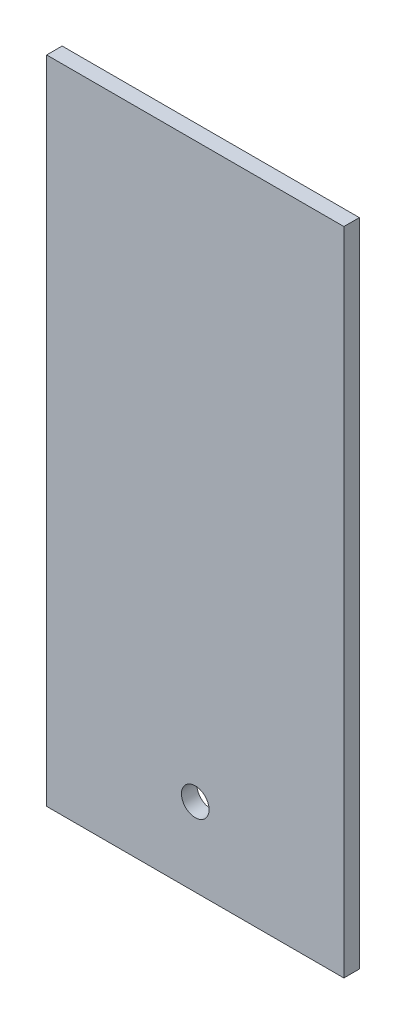
ISO-10303-21;
HEADER;
FILE_DESCRIPTION(('STEP AP214'),'2;1');
FILE_NAME('part.step','',(''),(''),'','','');
FILE_SCHEMA(('AUTOMOTIVE_DESIGN { 1 0 10303 214 1 1 1 1 }'));
ENDSEC;
DATA;
#1=APPLICATION_CONTEXT('core data for automotive mechanical design processes');
#2=APPLICATION_PROTOCOL_DEFINITION('international standard','automotive_design',2000,#1);
#3=PRODUCT_CONTEXT('',#1,'mechanical');
#4=PRODUCT('Part','Part','',(#3));
#5=PRODUCT_RELATED_PRODUCT_CATEGORY('part','',(#4));
#6=PRODUCT_DEFINITION_FORMATION('','',#4);
#7=PRODUCT_DEFINITION_CONTEXT('part definition',#1,'design');
#8=PRODUCT_DEFINITION('design','',#6,#7);
#9=PRODUCT_DEFINITION_SHAPE('','',#8);
#10=(LENGTH_UNIT() NAMED_UNIT(*) SI_UNIT(.MILLI.,.METRE.));
#11=(NAMED_UNIT(*) PLANE_ANGLE_UNIT() SI_UNIT($,.RADIAN.));
#12=(NAMED_UNIT(*) SI_UNIT($,.STERADIAN.) SOLID_ANGLE_UNIT());
#13=UNCERTAINTY_MEASURE_WITH_UNIT(LENGTH_MEASURE(1.E-05),#10,'distance_accuracy_value','');
#14=(GEOMETRIC_REPRESENTATION_CONTEXT(3) GLOBAL_UNCERTAINTY_ASSIGNED_CONTEXT((#13)) GLOBAL_UNIT_ASSIGNED_CONTEXT((#10,
#11,#12)) REPRESENTATION_CONTEXT('',''));
#15=CARTESIAN_POINT('',(0.,0.,0.));
#16=DIRECTION('',(0.,0.,1.));
#17=DIRECTION('',(1.,0.,0.));
#18=AXIS2_PLACEMENT_3D('',#15,#16,#17);
#19=CARTESIAN_POINT('',(26.9,-58.9,1.4));
#20=DIRECTION('',(0.,1.,0.));
#21=DIRECTION('',(0.,0.,1.));
#22=AXIS2_PLACEMENT_3D('',#19,#20,#21);
#23=PLANE('',#22);
#24=DIRECTION('',(1.,0.,0.));
#25=VECTOR('',#24,1.);
#26=CARTESIAN_POINT('',(26.9,-58.9,-1.4));
#27=LINE('',#26,#25);
#28=CARTESIAN_POINT('',(-26.9,-58.9,-1.4));
#29=VERTEX_POINT('',#28);
#30=CARTESIAN_POINT('',(26.9,-58.9,-1.4));
#31=VERTEX_POINT('',#30);
#32=EDGE_CURVE('E102',#29,#31,#27,.T.);
#33=ORIENTED_EDGE('',*,*,#32,.T.);
#34=DIRECTION('',(0.,0.,-1.));
#35=VECTOR('',#34,1.);
#36=CARTESIAN_POINT('',(26.9,-58.9,1.4));
#37=LINE('',#36,#35);
#38=CARTESIAN_POINT('',(26.9,-58.9,1.4));
#39=VERTEX_POINT('',#38);
#40=EDGE_CURVE('E11',#39,#31,#37,.T.);
#41=ORIENTED_EDGE('',*,*,#40,.F.);
#42=DIRECTION('',(1.,0.,0.));
#43=VECTOR('',#42,1.);
#44=CARTESIAN_POINT('',(26.9,-58.9,1.4));
#45=LINE('',#44,#43);
#46=CARTESIAN_POINT('',(-26.9,-58.9,1.4));
#47=VERTEX_POINT('',#46);
#48=EDGE_CURVE('E90',#47,#39,#45,.T.);
#49=ORIENTED_EDGE('',*,*,#48,.F.);
#50=DIRECTION('',(0.,0.,-1.));
#51=VECTOR('',#50,1.);
#52=CARTESIAN_POINT('',(-26.9,-58.9,1.4));
#53=LINE('',#52,#51);
#54=EDGE_CURVE('E98',#47,#29,#53,.T.);
#55=ORIENTED_EDGE('',*,*,#54,.T.);
#56=EDGE_LOOP('',(#33,#41,#49,#55));
#57=FACE_BOUND('',#56,.T.);
#58=ADVANCED_FACE('F39',(#57),#23,.F.);
#59=CARTESIAN_POINT('',(26.9,58.9,1.4));
#60=DIRECTION('',(-1.,0.,0.));
#61=DIRECTION('',(0.,-1.,0.));
#62=AXIS2_PLACEMENT_3D('',#59,#60,#61);
#63=PLANE('',#62);
#64=DIRECTION('',(0.,1.,0.));
#65=VECTOR('',#64,1.);
#66=CARTESIAN_POINT('',(26.9,58.9,-1.4));
#67=LINE('',#66,#65);
#68=CARTESIAN_POINT('',(26.9,58.9,-1.4));
#69=VERTEX_POINT('',#68);
#70=EDGE_CURVE('E94',#31,#69,#67,.T.);
#71=ORIENTED_EDGE('',*,*,#70,.T.);
#72=DIRECTION('',(0.,0.,-1.));
#73=VECTOR('',#72,1.);
#74=CARTESIAN_POINT('',(26.9,58.9,1.4));
#75=LINE('',#74,#73);
#76=CARTESIAN_POINT('',(26.9,58.9,1.4));
#77=VERTEX_POINT('',#76);
#78=EDGE_CURVE('E47',#77,#69,#75,.T.);
#79=ORIENTED_EDGE('',*,*,#78,.F.);
#80=DIRECTION('',(0.,1.,0.));
#81=VECTOR('',#80,1.);
#82=CARTESIAN_POINT('',(26.9,58.9,1.4));
#83=LINE('',#82,#81);
#84=EDGE_CURVE('E85',#39,#77,#83,.T.);
#85=ORIENTED_EDGE('',*,*,#84,.F.);
#86=ORIENTED_EDGE('',*,*,#40,.T.);
#87=EDGE_LOOP('',(#71,#79,#85,#86));
#88=FACE_BOUND('',#87,.T.);
#89=ADVANCED_FACE('F93',(#88),#63,.F.);
#90=CARTESIAN_POINT('',(26.9,58.9,1.4));
#91=DIRECTION('',(0.,-1.,0.));
#92=DIRECTION('',(0.,0.,-1.));
#93=AXIS2_PLACEMENT_3D('',#90,#91,#92);
#94=PLANE('',#93);
#95=DIRECTION('',(-1.,0.,0.));
#96=VECTOR('',#95,1.);
#97=CARTESIAN_POINT('',(26.9,58.9,-1.4));
#98=LINE('',#97,#96);
#99=CARTESIAN_POINT('',(-26.9,58.9,-1.4));
#100=VERTEX_POINT('',#99);
#101=EDGE_CURVE('E72',#69,#100,#98,.T.);
#102=ORIENTED_EDGE('',*,*,#101,.T.);
#103=DIRECTION('',(0.,0.,-1.));
#104=VECTOR('',#103,1.);
#105=CARTESIAN_POINT('',(-26.9,58.9,1.4));
#106=LINE('',#105,#104);
#107=CARTESIAN_POINT('',(-26.9,58.9,1.4));
#108=VERTEX_POINT('',#107);
#109=EDGE_CURVE('E95',#108,#100,#106,.T.);
#110=ORIENTED_EDGE('',*,*,#109,.F.);
#111=DIRECTION('',(-1.,0.,0.));
#112=VECTOR('',#111,1.);
#113=CARTESIAN_POINT('',(26.9,58.9,1.4));
#114=LINE('',#113,#112);
#115=EDGE_CURVE('E88',#77,#108,#114,.T.);
#116=ORIENTED_EDGE('',*,*,#115,.F.);
#117=ORIENTED_EDGE('',*,*,#78,.T.);
#118=EDGE_LOOP('',(#102,#110,#116,#117));
#119=FACE_BOUND('',#118,.T.);
#120=ADVANCED_FACE('F96',(#119),#94,.F.);
#121=CARTESIAN_POINT('',(-26.9,58.9,1.4));
#122=DIRECTION('',(1.,0.,0.));
#123=DIRECTION('',(0.,1.,0.));
#124=AXIS2_PLACEMENT_3D('',#121,#122,#123);
#125=PLANE('',#124);
#126=DIRECTION('',(0.,-1.,0.));
#127=VECTOR('',#126,1.);
#128=CARTESIAN_POINT('',(-26.9,58.9,-1.4));
#129=LINE('',#128,#127);
#130=EDGE_CURVE('E78',#100,#29,#129,.T.);
#131=ORIENTED_EDGE('',*,*,#130,.T.);
#132=ORIENTED_EDGE('',*,*,#54,.F.);
#133=DIRECTION('',(0.,-1.,0.));
#134=VECTOR('',#133,1.);
#135=CARTESIAN_POINT('',(-26.9,58.9,1.4));
#136=LINE('',#135,#134);
#137=EDGE_CURVE('E55',#108,#47,#136,.T.);
#138=ORIENTED_EDGE('',*,*,#137,.F.);
#139=ORIENTED_EDGE('',*,*,#109,.T.);
#140=EDGE_LOOP('',(#131,#132,#138,#139));
#141=FACE_BOUND('',#140,.T.);
#142=ADVANCED_FACE('F110',(#141),#125,.F.);
#143=CARTESIAN_POINT('',(0.,0.,1.4));
#144=DIRECTION('',(0.,0.,1.));
#145=DIRECTION('',(1.,0.,0.));
#146=AXIS2_PLACEMENT_3D('',#143,#144,#145);
#147=PLANE('',#146);
#148=CARTESIAN_POINT('',(0.,-44.7169130905157,1.4));
#149=DIRECTION('',(0.,0.,1.));
#150=DIRECTION('',(1.,0.,0.));
#151=AXIS2_PLACEMENT_3D('',#148,#149,#150);
#152=CIRCLE('',#151,2.5);
#153=CARTESIAN_POINT('',(2.5,-44.7169130905157,1.4));
#154=VERTEX_POINT('',#153);
#155=EDGE_CURVE('E116',#154,#154,#152,.T.);
#156=ORIENTED_EDGE('',*,*,#155,.F.);
#157=EDGE_LOOP('',(#156));
#158=FACE_BOUND('',#157,.T.);
#159=ORIENTED_EDGE('',*,*,#48,.T.);
#160=ORIENTED_EDGE('',*,*,#84,.T.);
#161=ORIENTED_EDGE('',*,*,#115,.T.);
#162=ORIENTED_EDGE('',*,*,#137,.T.);
#163=EDGE_LOOP('',(#159,#160,#161,#162));
#164=FACE_BOUND('',#163,.T.);
#165=ADVANCED_FACE('F86',(#158,#164),#147,.T.);
#166=CARTESIAN_POINT('',(0.,0.,-1.4));
#167=DIRECTION('',(0.,0.,1.));
#168=DIRECTION('',(1.,0.,0.));
#169=AXIS2_PLACEMENT_3D('',#166,#167,#168);
#170=PLANE('',#169);
#171=CARTESIAN_POINT('',(0.,-44.7169130905157,-1.4));
#172=DIRECTION('',(0.,0.,1.));
#173=DIRECTION('',(1.,0.,0.));
#174=AXIS2_PLACEMENT_3D('',#171,#172,#173);
#175=CIRCLE('',#174,2.5);
#176=CARTESIAN_POINT('',(2.5,-44.7169130905157,-1.4));
#177=VERTEX_POINT('',#176);
#178=EDGE_CURVE('E105',#177,#177,#175,.T.);
#179=ORIENTED_EDGE('',*,*,#178,.T.);
#180=EDGE_LOOP('',(#179));
#181=FACE_BOUND('',#180,.T.);
#182=ORIENTED_EDGE('',*,*,#32,.F.);
#183=ORIENTED_EDGE('',*,*,#130,.F.);
#184=ORIENTED_EDGE('',*,*,#101,.F.);
#185=ORIENTED_EDGE('',*,*,#70,.F.);
#186=EDGE_LOOP('',(#182,#183,#184,#185));
#187=FACE_BOUND('',#186,.T.);
#188=ADVANCED_FACE('F113',(#181,#187),#170,.F.);
#189=CARTESIAN_POINT('',(0.,-44.7169130905157,-1.4));
#190=DIRECTION('',(0.,0.,1.));
#191=DIRECTION('',(1.,0.,0.));
#192=AXIS2_PLACEMENT_3D('',#189,#190,#191);
#193=CYLINDRICAL_SURFACE('',#192,2.5);
#194=ORIENTED_EDGE('',*,*,#178,.F.);
#195=EDGE_LOOP('',(#194));
#196=FACE_BOUND('',#195,.T.);
#197=ORIENTED_EDGE('',*,*,#155,.T.);
#198=EDGE_LOOP('',(#197));
#199=FACE_BOUND('',#198,.T.);
#200=ADVANCED_FACE('F123',(#196,#199),#193,.F.);
#201=CLOSED_SHELL('',(#58,#89,#120,#142,#165,#188,#200));
#202=MANIFOLD_SOLID_BREP('B2',#201);
#203=ADVANCED_BREP_SHAPE_REPRESENTATION('',(#18,#202),#14);
#204=SHAPE_DEFINITION_REPRESENTATION(#9,#203);
ENDSEC;
END-ISO-10303-21;
